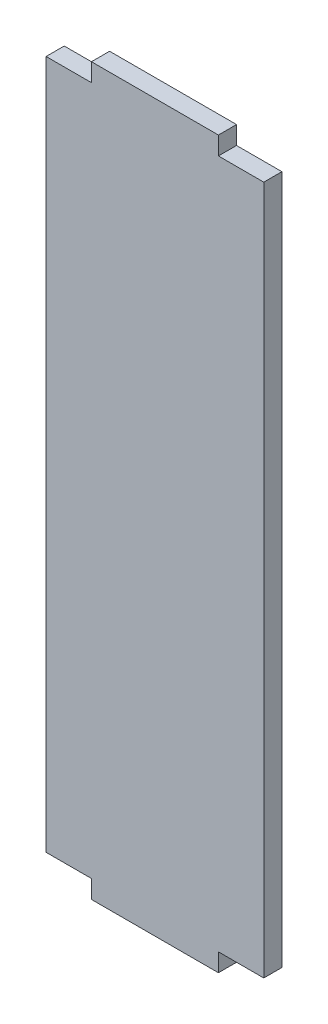
ISO-10303-21;
HEADER;
FILE_DESCRIPTION(('STEP AP214'),'2;1');
FILE_NAME('part.step','',(''),(''),'','','');
FILE_SCHEMA(('AUTOMOTIVE_DESIGN { 1 0 10303 214 1 1 1 1 }'));
ENDSEC;
DATA;
#1=APPLICATION_CONTEXT('core data for automotive mechanical design processes');
#2=APPLICATION_PROTOCOL_DEFINITION('international standard','automotive_design',2000,#1);
#3=PRODUCT_CONTEXT('',#1,'mechanical');
#4=PRODUCT('Part','Part','',(#3));
#5=PRODUCT_RELATED_PRODUCT_CATEGORY('part','',(#4));
#6=PRODUCT_DEFINITION_FORMATION('','',#4);
#7=PRODUCT_DEFINITION_CONTEXT('part definition',#1,'design');
#8=PRODUCT_DEFINITION('design','',#6,#7);
#9=PRODUCT_DEFINITION_SHAPE('','',#8);
#10=(LENGTH_UNIT() NAMED_UNIT(*) SI_UNIT(.MILLI.,.METRE.));
#11=(NAMED_UNIT(*) PLANE_ANGLE_UNIT() SI_UNIT($,.RADIAN.));
#12=(NAMED_UNIT(*) SI_UNIT($,.STERADIAN.) SOLID_ANGLE_UNIT());
#13=UNCERTAINTY_MEASURE_WITH_UNIT(LENGTH_MEASURE(1.E-05),#10,'distance_accuracy_value','');
#14=(GEOMETRIC_REPRESENTATION_CONTEXT(3) GLOBAL_UNCERTAINTY_ASSIGNED_CONTEXT((#13)) GLOBAL_UNIT_ASSIGNED_CONTEXT((#10,
#11,#12)) REPRESENTATION_CONTEXT('',''));
#15=CARTESIAN_POINT('',(0.,0.,0.));
#16=DIRECTION('',(0.,0.,1.));
#17=DIRECTION('',(1.,0.,0.));
#18=AXIS2_PLACEMENT_3D('',#15,#16,#17);
#19=CARTESIAN_POINT('',(-30.,95.,5.));
#20=DIRECTION('',(0.,-1.,0.));
#21=DIRECTION('',(0.,0.,-1.));
#22=AXIS2_PLACEMENT_3D('',#19,#20,#21);
#23=PLANE('',#22);
#24=DIRECTION('',(0.,0.,1.));
#25=VECTOR('',#24,1.);
#26=CARTESIAN_POINT('',(-17.5,95.,0.));
#27=LINE('',#26,#25);
#28=CARTESIAN_POINT('',(-17.5,95.,0.));
#29=VERTEX_POINT('',#28);
#30=CARTESIAN_POINT('',(-17.5,95.,5.));
#31=VERTEX_POINT('',#30);
#32=EDGE_CURVE('E125',#29,#31,#27,.T.);
#33=ORIENTED_EDGE('',*,*,#32,.F.);
#34=DIRECTION('',(-1.,0.,0.));
#35=VECTOR('',#34,1.);
#36=CARTESIAN_POINT('',(-30.,95.,0.));
#37=LINE('',#36,#35);
#38=CARTESIAN_POINT('',(-30.,95.,0.));
#39=VERTEX_POINT('',#38);
#40=EDGE_CURVE('E138',#29,#39,#37,.T.);
#41=ORIENTED_EDGE('',*,*,#40,.T.);
#42=DIRECTION('',(0.,0.,-1.));
#43=VECTOR('',#42,1.);
#44=CARTESIAN_POINT('',(-30.,95.,5.));
#45=LINE('',#44,#43);
#46=CARTESIAN_POINT('',(-30.,95.,5.));
#47=VERTEX_POINT('',#46);
#48=EDGE_CURVE('E41',#47,#39,#45,.T.);
#49=ORIENTED_EDGE('',*,*,#48,.F.);
#50=DIRECTION('',(-1.,0.,0.));
#51=VECTOR('',#50,1.);
#52=CARTESIAN_POINT('',(-30.,95.,5.));
#53=LINE('',#52,#51);
#54=EDGE_CURVE('E140',#31,#47,#53,.T.);
#55=ORIENTED_EDGE('',*,*,#54,.F.);
#56=EDGE_LOOP('',(#33,#41,#49,#55));
#57=FACE_BOUND('',#56,.T.);
#58=ADVANCED_FACE('F33',(#57),#23,.F.);
#59=CARTESIAN_POINT('',(-30.,-95.,5.));
#60=DIRECTION('',(0.,1.,0.));
#61=DIRECTION('',(0.,0.,1.));
#62=AXIS2_PLACEMENT_3D('',#59,#60,#61);
#63=PLANE('',#62);
#64=DIRECTION('',(0.,0.,1.));
#65=VECTOR('',#64,1.);
#66=CARTESIAN_POINT('',(17.5,-95.,0.));
#67=LINE('',#66,#65);
#68=CARTESIAN_POINT('',(17.5,-95.,0.));
#69=VERTEX_POINT('',#68);
#70=CARTESIAN_POINT('',(17.5,-95.,5.));
#71=VERTEX_POINT('',#70);
#72=EDGE_CURVE('E194',#69,#71,#67,.T.);
#73=ORIENTED_EDGE('',*,*,#72,.F.);
#74=DIRECTION('',(1.,0.,0.));
#75=VECTOR('',#74,1.);
#76=CARTESIAN_POINT('',(-30.,-95.,0.));
#77=LINE('',#76,#75);
#78=CARTESIAN_POINT('',(30.,-95.,0.));
#79=VERTEX_POINT('',#78);
#80=EDGE_CURVE('E159',#69,#79,#77,.T.);
#81=ORIENTED_EDGE('',*,*,#80,.T.);
#82=DIRECTION('',(0.,0.,-1.));
#83=VECTOR('',#82,1.);
#84=CARTESIAN_POINT('',(30.,-95.,5.));
#85=LINE('',#84,#83);
#86=CARTESIAN_POINT('',(30.,-95.,5.));
#87=VERTEX_POINT('',#86);
#88=EDGE_CURVE('E164',#87,#79,#85,.T.);
#89=ORIENTED_EDGE('',*,*,#88,.F.);
#90=DIRECTION('',(1.,0.,0.));
#91=VECTOR('',#90,1.);
#92=CARTESIAN_POINT('',(-30.,-95.,5.));
#93=LINE('',#92,#91);
#94=EDGE_CURVE('E178',#71,#87,#93,.T.);
#95=ORIENTED_EDGE('',*,*,#94,.F.);
#96=EDGE_LOOP('',(#73,#81,#89,#95));
#97=FACE_BOUND('',#96,.T.);
#98=ADVANCED_FACE('F237',(#97),#63,.F.);
#99=CARTESIAN_POINT('',(30.,95.,5.));
#100=DIRECTION('',(-1.,0.,0.));
#101=DIRECTION('',(0.,-1.,0.));
#102=AXIS2_PLACEMENT_3D('',#99,#100,#101);
#103=PLANE('',#102);
#104=DIRECTION('',(0.,1.,0.));
#105=VECTOR('',#104,1.);
#106=CARTESIAN_POINT('',(30.,95.,0.));
#107=LINE('',#106,#105);
#108=CARTESIAN_POINT('',(30.,95.,0.));
#109=VERTEX_POINT('',#108);
#110=EDGE_CURVE('E150',#79,#109,#107,.T.);
#111=ORIENTED_EDGE('',*,*,#110,.T.);
#112=DIRECTION('',(0.,0.,-1.));
#113=VECTOR('',#112,1.);
#114=CARTESIAN_POINT('',(30.,95.,5.));
#115=LINE('',#114,#113);
#116=CARTESIAN_POINT('',(30.,95.,5.));
#117=VERTEX_POINT('',#116);
#118=EDGE_CURVE('E11',#117,#109,#115,.T.);
#119=ORIENTED_EDGE('',*,*,#118,.F.);
#120=DIRECTION('',(0.,1.,0.));
#121=VECTOR('',#120,1.);
#122=CARTESIAN_POINT('',(30.,95.,5.));
#123=LINE('',#122,#121);
#124=EDGE_CURVE('E163',#87,#117,#123,.T.);
#125=ORIENTED_EDGE('',*,*,#124,.F.);
#126=ORIENTED_EDGE('',*,*,#88,.T.);
#127=EDGE_LOOP('',(#111,#119,#125,#126));
#128=FACE_BOUND('',#127,.T.);
#129=ADVANCED_FACE('F35',(#128),#103,.F.);
#130=CARTESIAN_POINT('',(17.5,95.,0.));
#131=VERTEX_POINT('',#130);
#132=EDGE_CURVE('E149',#109,#131,#37,.T.);
#133=ORIENTED_EDGE('',*,*,#132,.T.);
#134=DIRECTION('',(0.,0.,1.));
#135=VECTOR('',#134,1.);
#136=CARTESIAN_POINT('',(17.5,95.,0.));
#137=LINE('',#136,#135);
#138=CARTESIAN_POINT('',(17.5,95.,5.));
#139=VERTEX_POINT('',#138);
#140=EDGE_CURVE('E141',#131,#139,#137,.T.);
#141=ORIENTED_EDGE('',*,*,#140,.T.);
#142=EDGE_CURVE('E179',#117,#139,#53,.T.);
#143=ORIENTED_EDGE('',*,*,#142,.F.);
#144=ORIENTED_EDGE('',*,*,#118,.T.);
#145=EDGE_LOOP('',(#133,#141,#143,#144));
#146=FACE_BOUND('',#145,.T.);
#147=ADVANCED_FACE('F241',(#146),#23,.F.);
#148=CARTESIAN_POINT('',(-30.,95.,5.));
#149=DIRECTION('',(1.,0.,0.));
#150=DIRECTION('',(0.,1.,0.));
#151=AXIS2_PLACEMENT_3D('',#148,#149,#150);
#152=PLANE('',#151);
#153=DIRECTION('',(0.,-1.,0.));
#154=VECTOR('',#153,1.);
#155=CARTESIAN_POINT('',(-30.,95.,0.));
#156=LINE('',#155,#154);
#157=CARTESIAN_POINT('',(-30.,-95.,0.));
#158=VERTEX_POINT('',#157);
#159=EDGE_CURVE('E148',#39,#158,#156,.T.);
#160=ORIENTED_EDGE('',*,*,#159,.T.);
#161=DIRECTION('',(0.,0.,-1.));
#162=VECTOR('',#161,1.);
#163=CARTESIAN_POINT('',(-30.,-95.,5.));
#164=LINE('',#163,#162);
#165=CARTESIAN_POINT('',(-30.,-95.,5.));
#166=VERTEX_POINT('',#165);
#167=EDGE_CURVE('E167',#166,#158,#164,.T.);
#168=ORIENTED_EDGE('',*,*,#167,.F.);
#169=DIRECTION('',(0.,-1.,0.));
#170=VECTOR('',#169,1.);
#171=CARTESIAN_POINT('',(-30.,95.,5.));
#172=LINE('',#171,#170);
#173=EDGE_CURVE('E174',#47,#166,#172,.T.);
#174=ORIENTED_EDGE('',*,*,#173,.F.);
#175=ORIENTED_EDGE('',*,*,#48,.T.);
#176=EDGE_LOOP('',(#160,#168,#174,#175));
#177=FACE_BOUND('',#176,.T.);
#178=ADVANCED_FACE('F172',(#177),#152,.F.);
#179=CARTESIAN_POINT('',(-17.5,-95.,0.));
#180=VERTEX_POINT('',#179);
#181=EDGE_CURVE('E160',#158,#180,#77,.T.);
#182=ORIENTED_EDGE('',*,*,#181,.T.);
#183=DIRECTION('',(0.,0.,1.));
#184=VECTOR('',#183,1.);
#185=CARTESIAN_POINT('',(-17.5,-95.,0.));
#186=LINE('',#185,#184);
#187=CARTESIAN_POINT('',(-17.5,-95.,5.));
#188=VERTEX_POINT('',#187);
#189=EDGE_CURVE('E190',#180,#188,#186,.T.);
#190=ORIENTED_EDGE('',*,*,#189,.T.);
#191=EDGE_CURVE('E168',#166,#188,#93,.T.);
#192=ORIENTED_EDGE('',*,*,#191,.F.);
#193=ORIENTED_EDGE('',*,*,#167,.T.);
#194=EDGE_LOOP('',(#182,#190,#192,#193));
#195=FACE_BOUND('',#194,.T.);
#196=ADVANCED_FACE('F189',(#195),#63,.F.);
#197=CARTESIAN_POINT('',(0.,0.,5.));
#198=DIRECTION('',(0.,0.,1.));
#199=DIRECTION('',(1.,0.,0.));
#200=AXIS2_PLACEMENT_3D('',#197,#198,#199);
#201=PLANE('',#200);
#202=ORIENTED_EDGE('',*,*,#124,.T.);
#203=ORIENTED_EDGE('',*,*,#142,.T.);
#204=DIRECTION('',(0.,1.,0.));
#205=VECTOR('',#204,1.);
#206=CARTESIAN_POINT('',(17.5,100.,5.));
#207=LINE('',#206,#205);
#208=CARTESIAN_POINT('',(17.5,100.,5.));
#209=VERTEX_POINT('',#208);
#210=EDGE_CURVE('E48',#139,#209,#207,.T.);
#211=ORIENTED_EDGE('',*,*,#210,.T.);
#212=DIRECTION('',(-1.,0.,0.));
#213=VECTOR('',#212,1.);
#214=CARTESIAN_POINT('',(-17.5,100.,5.));
#215=LINE('',#214,#213);
#216=CARTESIAN_POINT('',(-17.5,100.,5.));
#217=VERTEX_POINT('',#216);
#218=EDGE_CURVE('E133',#209,#217,#215,.T.);
#219=ORIENTED_EDGE('',*,*,#218,.T.);
#220=DIRECTION('',(0.,-1.,0.));
#221=VECTOR('',#220,1.);
#222=CARTESIAN_POINT('',(-17.5,100.,5.));
#223=LINE('',#222,#221);
#224=EDGE_CURVE('E203',#217,#31,#223,.T.);
#225=ORIENTED_EDGE('',*,*,#224,.T.);
#226=ORIENTED_EDGE('',*,*,#54,.T.);
#227=ORIENTED_EDGE('',*,*,#173,.T.);
#228=ORIENTED_EDGE('',*,*,#191,.T.);
#229=DIRECTION('',(0.,-1.,0.));
#230=VECTOR('',#229,1.);
#231=CARTESIAN_POINT('',(-17.5,-100.,5.));
#232=LINE('',#231,#230);
#233=CARTESIAN_POINT('',(-17.5,-100.,5.));
#234=VERTEX_POINT('',#233);
#235=EDGE_CURVE('E56',#188,#234,#232,.T.);
#236=ORIENTED_EDGE('',*,*,#235,.T.);
#237=DIRECTION('',(1.,0.,0.));
#238=VECTOR('',#237,1.);
#239=CARTESIAN_POINT('',(-17.5,-100.,5.));
#240=LINE('',#239,#238);
#241=CARTESIAN_POINT('',(17.5,-100.,5.));
#242=VERTEX_POINT('',#241);
#243=EDGE_CURVE('E219',#234,#242,#240,.T.);
#244=ORIENTED_EDGE('',*,*,#243,.T.);
#245=DIRECTION('',(0.,1.,0.));
#246=VECTOR('',#245,1.);
#247=CARTESIAN_POINT('',(17.5,-100.,5.));
#248=LINE('',#247,#246);
#249=EDGE_CURVE('E212',#242,#71,#248,.T.);
#250=ORIENTED_EDGE('',*,*,#249,.T.);
#251=ORIENTED_EDGE('',*,*,#94,.T.);
#252=EDGE_LOOP('',(#202,#203,#211,#219,#225,#226,#227,#228,#236,#244,#250,#251));
#253=FACE_BOUND('',#252,.T.);
#254=ADVANCED_FACE('F185',(#253),#201,.T.);
#255=CARTESIAN_POINT('',(0.,0.,0.));
#256=DIRECTION('',(0.,0.,1.));
#257=DIRECTION('',(1.,0.,0.));
#258=AXIS2_PLACEMENT_3D('',#255,#256,#257);
#259=PLANE('',#258);
#260=ORIENTED_EDGE('',*,*,#110,.F.);
#261=ORIENTED_EDGE('',*,*,#80,.F.);
#262=DIRECTION('',(0.,1.,0.));
#263=VECTOR('',#262,1.);
#264=CARTESIAN_POINT('',(17.5,-100.,0.));
#265=LINE('',#264,#263);
#266=CARTESIAN_POINT('',(17.5,-100.,0.));
#267=VERTEX_POINT('',#266);
#268=EDGE_CURVE('E216',#267,#69,#265,.T.);
#269=ORIENTED_EDGE('',*,*,#268,.F.);
#270=DIRECTION('',(1.,0.,0.));
#271=VECTOR('',#270,1.);
#272=CARTESIAN_POINT('',(-17.5,-100.,0.));
#273=LINE('',#272,#271);
#274=CARTESIAN_POINT('',(-17.5,-100.,0.));
#275=VERTEX_POINT('',#274);
#276=EDGE_CURVE('E197',#275,#267,#273,.T.);
#277=ORIENTED_EDGE('',*,*,#276,.F.);
#278=DIRECTION('',(0.,-1.,0.));
#279=VECTOR('',#278,1.);
#280=CARTESIAN_POINT('',(-17.5,-100.,0.));
#281=LINE('',#280,#279);
#282=EDGE_CURVE('E218',#180,#275,#281,.T.);
#283=ORIENTED_EDGE('',*,*,#282,.F.);
#284=ORIENTED_EDGE('',*,*,#181,.F.);
#285=ORIENTED_EDGE('',*,*,#159,.F.);
#286=ORIENTED_EDGE('',*,*,#40,.F.);
#287=DIRECTION('',(0.,-1.,0.));
#288=VECTOR('',#287,1.);
#289=CARTESIAN_POINT('',(-17.5,100.,0.));
#290=LINE('',#289,#288);
#291=CARTESIAN_POINT('',(-17.5,100.,0.));
#292=VERTEX_POINT('',#291);
#293=EDGE_CURVE('E121',#292,#29,#290,.T.);
#294=ORIENTED_EDGE('',*,*,#293,.F.);
#295=DIRECTION('',(-1.,0.,0.));
#296=VECTOR('',#295,1.);
#297=CARTESIAN_POINT('',(-17.5,100.,0.));
#298=LINE('',#297,#296);
#299=CARTESIAN_POINT('',(17.5,100.,0.));
#300=VERTEX_POINT('',#299);
#301=EDGE_CURVE('E142',#300,#292,#298,.T.);
#302=ORIENTED_EDGE('',*,*,#301,.F.);
#303=DIRECTION('',(0.,1.,0.));
#304=VECTOR('',#303,1.);
#305=CARTESIAN_POINT('',(17.5,100.,0.));
#306=LINE('',#305,#304);
#307=EDGE_CURVE('E132',#131,#300,#306,.T.);
#308=ORIENTED_EDGE('',*,*,#307,.F.);
#309=ORIENTED_EDGE('',*,*,#132,.F.);
#310=EDGE_LOOP('',(#260,#261,#269,#277,#283,#284,#285,#286,#294,#302,#308,#309));
#311=FACE_BOUND('',#310,.T.);
#312=ADVANCED_FACE('F146',(#311),#259,.F.);
#313=CARTESIAN_POINT('',(17.5,-100.,0.));
#314=DIRECTION('',(1.,0.,0.));
#315=DIRECTION('',(0.,0.,-1.));
#316=AXIS2_PLACEMENT_3D('',#313,#314,#315);
#317=PLANE('',#316);
#318=ORIENTED_EDGE('',*,*,#249,.F.);
#319=DIRECTION('',(0.,0.,1.));
#320=VECTOR('',#319,1.);
#321=CARTESIAN_POINT('',(17.5,-100.,0.));
#322=LINE('',#321,#320);
#323=EDGE_CURVE('E154',#267,#242,#322,.T.);
#324=ORIENTED_EDGE('',*,*,#323,.F.);
#325=ORIENTED_EDGE('',*,*,#268,.T.);
#326=ORIENTED_EDGE('',*,*,#72,.T.);
#327=EDGE_LOOP('',(#318,#324,#325,#326));
#328=FACE_BOUND('',#327,.T.);
#329=ADVANCED_FACE('F232',(#328),#317,.T.);
#330=CARTESIAN_POINT('',(-17.5,-100.,0.));
#331=DIRECTION('',(0.,-1.,0.));
#332=DIRECTION('',(0.,0.,-1.));
#333=AXIS2_PLACEMENT_3D('',#330,#331,#332);
#334=PLANE('',#333);
#335=ORIENTED_EDGE('',*,*,#243,.F.);
#336=DIRECTION('',(0.,0.,1.));
#337=VECTOR('',#336,1.);
#338=CARTESIAN_POINT('',(-17.5,-100.,0.));
#339=LINE('',#338,#337);
#340=EDGE_CURVE('E193',#275,#234,#339,.T.);
#341=ORIENTED_EDGE('',*,*,#340,.F.);
#342=ORIENTED_EDGE('',*,*,#276,.T.);
#343=ORIENTED_EDGE('',*,*,#323,.T.);
#344=EDGE_LOOP('',(#335,#341,#342,#343));
#345=FACE_BOUND('',#344,.T.);
#346=ADVANCED_FACE('F228',(#345),#334,.T.);
#347=CARTESIAN_POINT('',(-17.5,-100.,0.));
#348=DIRECTION('',(-1.,0.,0.));
#349=DIRECTION('',(0.,0.,1.));
#350=AXIS2_PLACEMENT_3D('',#347,#348,#349);
#351=PLANE('',#350);
#352=ORIENTED_EDGE('',*,*,#235,.F.);
#353=ORIENTED_EDGE('',*,*,#189,.F.);
#354=ORIENTED_EDGE('',*,*,#282,.T.);
#355=ORIENTED_EDGE('',*,*,#340,.T.);
#356=EDGE_LOOP('',(#352,#353,#354,#355));
#357=FACE_BOUND('',#356,.T.);
#358=ADVANCED_FACE('F247',(#357),#351,.T.);
#359=CARTESIAN_POINT('',(-17.5,100.,0.));
#360=DIRECTION('',(-1.,0.,0.));
#361=DIRECTION('',(0.,0.,1.));
#362=AXIS2_PLACEMENT_3D('',#359,#360,#361);
#363=PLANE('',#362);
#364=ORIENTED_EDGE('',*,*,#224,.F.);
#365=DIRECTION('',(0.,0.,1.));
#366=VECTOR('',#365,1.);
#367=CARTESIAN_POINT('',(-17.5,100.,0.));
#368=LINE('',#367,#366);
#369=EDGE_CURVE('E127',#292,#217,#368,.T.);
#370=ORIENTED_EDGE('',*,*,#369,.F.);
#371=ORIENTED_EDGE('',*,*,#293,.T.);
#372=ORIENTED_EDGE('',*,*,#32,.T.);
#373=EDGE_LOOP('',(#364,#370,#371,#372));
#374=FACE_BOUND('',#373,.T.);
#375=ADVANCED_FACE('F124',(#374),#363,.T.);
#376=CARTESIAN_POINT('',(-17.5,100.,0.));
#377=DIRECTION('',(0.,1.,0.));
#378=DIRECTION('',(-1.,0.,0.));
#379=AXIS2_PLACEMENT_3D('',#376,#377,#378);
#380=PLANE('',#379);
#381=ORIENTED_EDGE('',*,*,#218,.F.);
#382=DIRECTION('',(0.,0.,1.));
#383=VECTOR('',#382,1.);
#384=CARTESIAN_POINT('',(17.5,100.,0.));
#385=LINE('',#384,#383);
#386=EDGE_CURVE('E213',#300,#209,#385,.T.);
#387=ORIENTED_EDGE('',*,*,#386,.F.);
#388=ORIENTED_EDGE('',*,*,#301,.T.);
#389=ORIENTED_EDGE('',*,*,#369,.T.);
#390=EDGE_LOOP('',(#381,#387,#388,#389));
#391=FACE_BOUND('',#390,.T.);
#392=ADVANCED_FACE('F243',(#391),#380,.T.);
#393=CARTESIAN_POINT('',(17.5,100.,0.));
#394=DIRECTION('',(1.,0.,0.));
#395=DIRECTION('',(0.,0.,-1.));
#396=AXIS2_PLACEMENT_3D('',#393,#394,#395);
#397=PLANE('',#396);
#398=ORIENTED_EDGE('',*,*,#210,.F.);
#399=ORIENTED_EDGE('',*,*,#140,.F.);
#400=ORIENTED_EDGE('',*,*,#307,.T.);
#401=ORIENTED_EDGE('',*,*,#386,.T.);
#402=EDGE_LOOP('',(#398,#399,#400,#401));
#403=FACE_BOUND('',#402,.T.);
#404=ADVANCED_FACE('F246',(#403),#397,.T.);
#405=CLOSED_SHELL('',(#58,#98,#129,#147,#178,#196,#254,#312,#329,#346,#358,#375,#392,#404));
#406=MANIFOLD_SOLID_BREP('B2',#405);
#407=ADVANCED_BREP_SHAPE_REPRESENTATION('',(#18,#406),#14);
#408=SHAPE_DEFINITION_REPRESENTATION(#9,#407);
ENDSEC;
END-ISO-10303-21;
